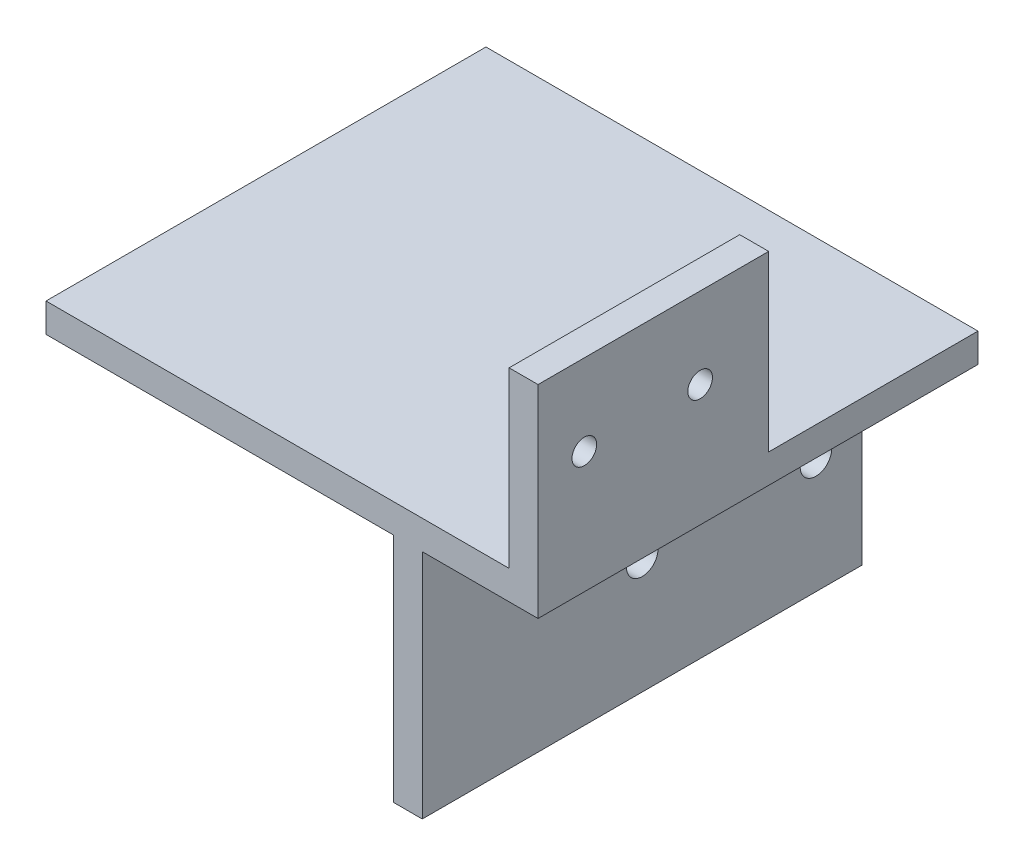
ISO-10303-21;
HEADER;
FILE_DESCRIPTION(('STEP AP214'),'2;1');
FILE_NAME('part.step','',(''),(''),'','','');
FILE_SCHEMA(('AUTOMOTIVE_DESIGN { 1 0 10303 214 1 1 1 1 }'));
ENDSEC;
DATA;
#1=APPLICATION_CONTEXT('core data for automotive mechanical design processes');
#2=APPLICATION_PROTOCOL_DEFINITION('international standard','automotive_design',2000,#1);
#3=PRODUCT_CONTEXT('',#1,'mechanical');
#4=PRODUCT('Part','Part','',(#3));
#5=PRODUCT_RELATED_PRODUCT_CATEGORY('part','',(#4));
#6=PRODUCT_DEFINITION_FORMATION('','',#4);
#7=PRODUCT_DEFINITION_CONTEXT('part definition',#1,'design');
#8=PRODUCT_DEFINITION('design','',#6,#7);
#9=PRODUCT_DEFINITION_SHAPE('','',#8);
#10=(LENGTH_UNIT() NAMED_UNIT(*) SI_UNIT(.MILLI.,.METRE.));
#11=(NAMED_UNIT(*) PLANE_ANGLE_UNIT() SI_UNIT($,.RADIAN.));
#12=(NAMED_UNIT(*) SI_UNIT($,.STERADIAN.) SOLID_ANGLE_UNIT());
#13=UNCERTAINTY_MEASURE_WITH_UNIT(LENGTH_MEASURE(1.E-05),#10,'distance_accuracy_value','');
#14=(GEOMETRIC_REPRESENTATION_CONTEXT(3) GLOBAL_UNCERTAINTY_ASSIGNED_CONTEXT((#13)) GLOBAL_UNIT_ASSIGNED_CONTEXT((#10,
#11,#12)) REPRESENTATION_CONTEXT('',''));
#15=CARTESIAN_POINT('',(0.,0.,0.));
#16=DIRECTION('',(0.,0.,1.));
#17=DIRECTION('',(1.,0.,0.));
#18=AXIS2_PLACEMENT_3D('',#15,#16,#17);
#19=CARTESIAN_POINT('',(15.875,28.575,48.26));
#20=DIRECTION('',(0.,-1.,0.));
#21=DIRECTION('',(1.,0.,0.));
#22=AXIS2_PLACEMENT_3D('',#19,#20,#21);
#23=PLANE('',#22);
#24=DIRECTION('',(0.,0.,1.));
#25=VECTOR('',#24,1.);
#26=CARTESIAN_POINT('',(12.7,28.575,48.26));
#27=LINE('',#26,#25);
#28=CARTESIAN_POINT('',(12.7,28.575,22.9610956435768));
#29=VERTEX_POINT('',#28);
#30=CARTESIAN_POINT('',(12.7,28.575,48.26));
#31=VERTEX_POINT('',#30);
#32=EDGE_CURVE('E135',#29,#31,#27,.T.);
#33=ORIENTED_EDGE('',*,*,#32,.F.);
#34=DIRECTION('',(-1.,0.,0.));
#35=VECTOR('',#34,1.);
#36=CARTESIAN_POINT('',(15.875,28.575,22.9610956435768));
#37=LINE('',#36,#35);
#38=CARTESIAN_POINT('',(15.875,28.575,22.9610956435768));
#39=VERTEX_POINT('',#38);
#40=EDGE_CURVE('E49',#39,#29,#37,.T.);
#41=ORIENTED_EDGE('',*,*,#40,.F.);
#42=DIRECTION('',(0.,0.,-1.));
#43=VECTOR('',#42,1.);
#44=CARTESIAN_POINT('',(15.875,28.575,48.26));
#45=LINE('',#44,#43);
#46=CARTESIAN_POINT('',(15.875,28.575,0.));
#47=VERTEX_POINT('',#46);
#48=EDGE_CURVE('E139',#39,#47,#45,.T.);
#49=ORIENTED_EDGE('',*,*,#48,.T.);
#50=DIRECTION('',(-1.,0.,0.));
#51=VECTOR('',#50,1.);
#52=CARTESIAN_POINT('',(15.875,28.575,0.));
#53=LINE('',#52,#51);
#54=CARTESIAN_POINT('',(-38.1,28.575,0.));
#55=VERTEX_POINT('',#54);
#56=EDGE_CURVE('E209',#47,#55,#53,.T.);
#57=ORIENTED_EDGE('',*,*,#56,.T.);
#58=DIRECTION('',(0.,0.,-1.));
#59=VECTOR('',#58,1.);
#60=CARTESIAN_POINT('',(-38.1,28.575,48.26));
#61=LINE('',#60,#59);
#62=CARTESIAN_POINT('',(-38.1,28.575,48.26));
#63=VERTEX_POINT('',#62);
#64=EDGE_CURVE('E179',#63,#55,#61,.T.);
#65=ORIENTED_EDGE('',*,*,#64,.F.);
#66=DIRECTION('',(-1.,0.,0.));
#67=VECTOR('',#66,1.);
#68=CARTESIAN_POINT('',(15.875,28.575,48.26));
#69=LINE('',#68,#67);
#70=EDGE_CURVE('E55',#31,#63,#69,.T.);
#71=ORIENTED_EDGE('',*,*,#70,.F.);
#72=EDGE_LOOP('',(#33,#41,#49,#57,#65,#71));
#73=FACE_BOUND('',#72,.T.);
#74=ADVANCED_FACE('F32',(#73),#23,.F.);
#75=CARTESIAN_POINT('',(0.,25.4,48.26));
#76=DIRECTION('',(1.,0.,0.));
#77=DIRECTION('',(0.,0.,-1.));
#78=AXIS2_PLACEMENT_3D('',#75,#76,#77);
#79=PLANE('',#78);
#80=CARTESIAN_POINT('',(0.,12.7,5.08));
#81=DIRECTION('',(-1.,0.,0.));
#82=DIRECTION('',(0.,0.,1.));
#83=AXIS2_PLACEMENT_3D('',#80,#81,#82);
#84=CIRCLE('',#83,1.7272);
#85=CARTESIAN_POINT('',(0.,12.7,6.8072));
#86=VERTEX_POINT('',#85);
#87=EDGE_CURVE('E261',#86,#86,#84,.T.);
#88=ORIENTED_EDGE('',*,*,#87,.F.);
#89=EDGE_LOOP('',(#88));
#90=FACE_BOUND('',#89,.T.);
#91=CARTESIAN_POINT('',(0.,12.7,24.13));
#92=DIRECTION('',(-1.,0.,0.));
#93=DIRECTION('',(0.,0.,1.));
#94=AXIS2_PLACEMENT_3D('',#91,#92,#93);
#95=CIRCLE('',#94,1.7272);
#96=CARTESIAN_POINT('',(0.,12.7,25.8572));
#97=VERTEX_POINT('',#96);
#98=EDGE_CURVE('E255',#97,#97,#95,.T.);
#99=ORIENTED_EDGE('',*,*,#98,.F.);
#100=EDGE_LOOP('',(#99));
#101=FACE_BOUND('',#100,.T.);
#102=DIRECTION('',(0.,-1.,0.));
#103=VECTOR('',#102,1.);
#104=CARTESIAN_POINT('',(0.,25.4,0.));
#105=LINE('',#104,#103);
#106=CARTESIAN_POINT('',(0.,25.4,0.));
#107=VERTEX_POINT('',#106);
#108=CARTESIAN_POINT('',(0.,0.,0.));
#109=VERTEX_POINT('',#108);
#110=EDGE_CURVE('E140',#107,#109,#105,.T.);
#111=ORIENTED_EDGE('',*,*,#110,.T.);
#112=DIRECTION('',(0.,0.,-1.));
#113=VECTOR('',#112,1.);
#114=CARTESIAN_POINT('',(0.,0.,48.26));
#115=LINE('',#114,#113);
#116=CARTESIAN_POINT('',(0.,0.,48.26));
#117=VERTEX_POINT('',#116);
#118=EDGE_CURVE('E11',#117,#109,#115,.T.);
#119=ORIENTED_EDGE('',*,*,#118,.F.);
#120=DIRECTION('',(0.,-1.,0.));
#121=VECTOR('',#120,1.);
#122=CARTESIAN_POINT('',(0.,25.4,48.26));
#123=LINE('',#122,#121);
#124=CARTESIAN_POINT('',(0.,25.4,48.26));
#125=VERTEX_POINT('',#124);
#126=EDGE_CURVE('E158',#125,#117,#123,.T.);
#127=ORIENTED_EDGE('',*,*,#126,.F.);
#128=DIRECTION('',(0.,0.,-1.));
#129=VECTOR('',#128,1.);
#130=CARTESIAN_POINT('',(0.,25.4,48.26));
#131=LINE('',#130,#129);
#132=EDGE_CURVE('E214',#125,#107,#131,.T.);
#133=ORIENTED_EDGE('',*,*,#132,.T.);
#134=EDGE_LOOP('',(#111,#119,#127,#133));
#135=FACE_BOUND('',#134,.T.);
#136=ADVANCED_FACE('F34',(#90,#101,#135),#79,.F.);
#137=CARTESIAN_POINT('',(3.175,0.,48.26));
#138=DIRECTION('',(0.,1.,0.));
#139=DIRECTION('',(0.,0.,1.));
#140=AXIS2_PLACEMENT_3D('',#137,#138,#139);
#141=PLANE('',#140);
#142=DIRECTION('',(1.,0.,0.));
#143=VECTOR('',#142,1.);
#144=CARTESIAN_POINT('',(3.175,0.,0.));
#145=LINE('',#144,#143);
#146=CARTESIAN_POINT('',(3.175,0.,0.));
#147=VERTEX_POINT('',#146);
#148=EDGE_CURVE('E143',#109,#147,#145,.T.);
#149=ORIENTED_EDGE('',*,*,#148,.T.);
#150=DIRECTION('',(0.,0.,-1.));
#151=VECTOR('',#150,1.);
#152=CARTESIAN_POINT('',(3.175,0.,48.26));
#153=LINE('',#152,#151);
#154=CARTESIAN_POINT('',(3.175,0.,48.26));
#155=VERTEX_POINT('',#154);
#156=EDGE_CURVE('E41',#155,#147,#153,.T.);
#157=ORIENTED_EDGE('',*,*,#156,.F.);
#158=DIRECTION('',(1.,0.,0.));
#159=VECTOR('',#158,1.);
#160=CARTESIAN_POINT('',(3.175,0.,48.26));
#161=LINE('',#160,#159);
#162=EDGE_CURVE('E161',#117,#155,#161,.T.);
#163=ORIENTED_EDGE('',*,*,#162,.F.);
#164=ORIENTED_EDGE('',*,*,#118,.T.);
#165=EDGE_LOOP('',(#149,#157,#163,#164));
#166=FACE_BOUND('',#165,.T.);
#167=ADVANCED_FACE('F270',(#166),#141,.F.);
#168=CARTESIAN_POINT('',(3.175,25.4,48.26));
#169=DIRECTION('',(-1.,0.,0.));
#170=DIRECTION('',(0.,-1.,0.));
#171=AXIS2_PLACEMENT_3D('',#168,#169,#170);
#172=PLANE('',#171);
#173=CARTESIAN_POINT('',(3.175,12.7,5.08));
#174=DIRECTION('',(-1.,0.,0.));
#175=DIRECTION('',(0.,-1.,0.));
#176=AXIS2_PLACEMENT_3D('',#173,#174,#175);
#177=CIRCLE('',#176,1.7272);
#178=CARTESIAN_POINT('',(3.175,10.9728,5.08));
#179=VERTEX_POINT('',#178);
#180=EDGE_CURVE('E258',#179,#179,#177,.T.);
#181=ORIENTED_EDGE('',*,*,#180,.T.);
#182=EDGE_LOOP('',(#181));
#183=FACE_BOUND('',#182,.T.);
#184=CARTESIAN_POINT('',(3.175,12.7,24.13));
#185=DIRECTION('',(-1.,0.,0.));
#186=DIRECTION('',(0.,-1.,0.));
#187=AXIS2_PLACEMENT_3D('',#184,#185,#186);
#188=CIRCLE('',#187,1.7272);
#189=CARTESIAN_POINT('',(3.175,10.9728,24.13));
#190=VERTEX_POINT('',#189);
#191=EDGE_CURVE('E252',#190,#190,#188,.T.);
#192=ORIENTED_EDGE('',*,*,#191,.T.);
#193=EDGE_LOOP('',(#192));
#194=FACE_BOUND('',#193,.T.);
#195=DIRECTION('',(0.,1.,0.));
#196=VECTOR('',#195,1.);
#197=CARTESIAN_POINT('',(3.175,25.4,0.));
#198=LINE('',#197,#196);
#199=CARTESIAN_POINT('',(3.175,25.4,0.));
#200=VERTEX_POINT('',#199);
#201=EDGE_CURVE('E195',#147,#200,#198,.T.);
#202=ORIENTED_EDGE('',*,*,#201,.T.);
#203=DIRECTION('',(0.,0.,-1.));
#204=VECTOR('',#203,1.);
#205=CARTESIAN_POINT('',(3.175,25.4,48.26));
#206=LINE('',#205,#204);
#207=CARTESIAN_POINT('',(3.175,25.4,48.26));
#208=VERTEX_POINT('',#207);
#209=EDGE_CURVE('E186',#208,#200,#206,.T.);
#210=ORIENTED_EDGE('',*,*,#209,.F.);
#211=DIRECTION('',(0.,1.,0.));
#212=VECTOR('',#211,1.);
#213=CARTESIAN_POINT('',(3.175,25.4,48.26));
#214=LINE('',#213,#212);
#215=EDGE_CURVE('E164',#155,#208,#214,.T.);
#216=ORIENTED_EDGE('',*,*,#215,.F.);
#217=ORIENTED_EDGE('',*,*,#156,.T.);
#218=EDGE_LOOP('',(#202,#210,#216,#217));
#219=FACE_BOUND('',#218,.T.);
#220=ADVANCED_FACE('F193',(#183,#194,#219),#172,.F.);
#221=CARTESIAN_POINT('',(15.875,25.4,48.26));
#222=DIRECTION('',(0.,1.,0.));
#223=DIRECTION('',(-1.,0.,0.));
#224=AXIS2_PLACEMENT_3D('',#221,#222,#223);
#225=PLANE('',#224);
#226=DIRECTION('',(1.,0.,0.));
#227=VECTOR('',#226,1.);
#228=CARTESIAN_POINT('',(15.875,25.4,0.));
#229=LINE('',#228,#227);
#230=CARTESIAN_POINT('',(15.875,25.4,0.));
#231=VERTEX_POINT('',#230);
#232=EDGE_CURVE('E202',#200,#231,#229,.T.);
#233=ORIENTED_EDGE('',*,*,#232,.T.);
#234=DIRECTION('',(0.,0.,-1.));
#235=VECTOR('',#234,1.);
#236=CARTESIAN_POINT('',(15.875,25.4,48.26));
#237=LINE('',#236,#235);
#238=CARTESIAN_POINT('',(15.875,25.4,48.26));
#239=VERTEX_POINT('',#238);
#240=EDGE_CURVE('E178',#239,#231,#237,.T.);
#241=ORIENTED_EDGE('',*,*,#240,.F.);
#242=DIRECTION('',(1.,0.,0.));
#243=VECTOR('',#242,1.);
#244=CARTESIAN_POINT('',(15.875,25.4,48.26));
#245=LINE('',#244,#243);
#246=EDGE_CURVE('E166',#208,#239,#245,.T.);
#247=ORIENTED_EDGE('',*,*,#246,.F.);
#248=ORIENTED_EDGE('',*,*,#209,.T.);
#249=EDGE_LOOP('',(#233,#241,#247,#248));
#250=FACE_BOUND('',#249,.T.);
#251=ADVANCED_FACE('F281',(#250),#225,.F.);
#252=CARTESIAN_POINT('',(15.875,28.575,48.26));
#253=DIRECTION('',(-1.,0.,0.));
#254=DIRECTION('',(0.,-1.,0.));
#255=AXIS2_PLACEMENT_3D('',#252,#253,#254);
#256=PLANE('',#255);
#257=CARTESIAN_POINT('',(15.875,38.735,43.18));
#258=DIRECTION('',(1.,0.,0.));
#259=DIRECTION('',(0.,0.,-1.));
#260=AXIS2_PLACEMENT_3D('',#257,#258,#259);
#261=CIRCLE('',#260,1.35255);
#262=CARTESIAN_POINT('',(15.875,38.735,41.82745));
#263=VERTEX_POINT('',#262);
#264=EDGE_CURVE('E249',#263,#263,#261,.T.);
#265=ORIENTED_EDGE('',*,*,#264,.F.);
#266=EDGE_LOOP('',(#265));
#267=FACE_BOUND('',#266,.T.);
#268=CARTESIAN_POINT('',(15.875,38.735,30.48));
#269=DIRECTION('',(1.,0.,0.));
#270=DIRECTION('',(0.,0.,-1.));
#271=AXIS2_PLACEMENT_3D('',#268,#269,#270);
#272=CIRCLE('',#271,1.35255);
#273=CARTESIAN_POINT('',(15.875,38.735,29.12745));
#274=VERTEX_POINT('',#273);
#275=EDGE_CURVE('E243',#274,#274,#272,.T.);
#276=ORIENTED_EDGE('',*,*,#275,.F.);
#277=EDGE_LOOP('',(#276));
#278=FACE_BOUND('',#277,.T.);
#279=DIRECTION('',(0.,1.,0.));
#280=VECTOR('',#279,1.);
#281=CARTESIAN_POINT('',(15.875,28.575,0.));
#282=LINE('',#281,#280);
#283=EDGE_CURVE('E204',#231,#47,#282,.T.);
#284=ORIENTED_EDGE('',*,*,#283,.T.);
#285=ORIENTED_EDGE('',*,*,#48,.F.);
#286=DIRECTION('',(0.,-1.,0.));
#287=VECTOR('',#286,1.);
#288=CARTESIAN_POINT('',(15.875,47.625,22.9610956435768));
#289=LINE('',#288,#287);
#290=CARTESIAN_POINT('',(15.875,47.625,22.9610956435768));
#291=VERTEX_POINT('',#290);
#292=EDGE_CURVE('E120',#291,#39,#289,.T.);
#293=ORIENTED_EDGE('',*,*,#292,.F.);
#294=DIRECTION('',(0.,0.,-1.));
#295=VECTOR('',#294,1.);
#296=CARTESIAN_POINT('',(15.875,47.625,48.26));
#297=LINE('',#296,#295);
#298=CARTESIAN_POINT('',(15.875,47.625,48.26));
#299=VERTEX_POINT('',#298);
#300=EDGE_CURVE('E126',#299,#291,#297,.T.);
#301=ORIENTED_EDGE('',*,*,#300,.F.);
#302=DIRECTION('',(0.,1.,0.));
#303=VECTOR('',#302,1.);
#304=CARTESIAN_POINT('',(15.875,28.575,48.26));
#305=LINE('',#304,#303);
#306=EDGE_CURVE('E168',#239,#299,#305,.T.);
#307=ORIENTED_EDGE('',*,*,#306,.F.);
#308=ORIENTED_EDGE('',*,*,#240,.T.);
#309=EDGE_LOOP('',(#284,#285,#293,#301,#307,#308));
#310=FACE_BOUND('',#309,.T.);
#311=ADVANCED_FACE('F138',(#267,#278,#310),#256,.F.);
#312=CARTESIAN_POINT('',(-38.1,28.575,48.26));
#313=DIRECTION('',(1.,0.,0.));
#314=DIRECTION('',(0.,0.,-1.));
#315=AXIS2_PLACEMENT_3D('',#312,#313,#314);
#316=PLANE('',#315);
#317=DIRECTION('',(0.,-1.,0.));
#318=VECTOR('',#317,1.);
#319=CARTESIAN_POINT('',(-38.1,28.575,0.));
#320=LINE('',#319,#318);
#321=CARTESIAN_POINT('',(-38.1,25.4,0.));
#322=VERTEX_POINT('',#321);
#323=EDGE_CURVE('E211',#55,#322,#320,.T.);
#324=ORIENTED_EDGE('',*,*,#323,.T.);
#325=DIRECTION('',(0.,0.,-1.));
#326=VECTOR('',#325,1.);
#327=CARTESIAN_POINT('',(-38.1,25.4,48.26));
#328=LINE('',#327,#326);
#329=CARTESIAN_POINT('',(-38.1,25.4,48.26));
#330=VERTEX_POINT('',#329);
#331=EDGE_CURVE('E216',#330,#322,#328,.T.);
#332=ORIENTED_EDGE('',*,*,#331,.F.);
#333=DIRECTION('',(0.,-1.,0.));
#334=VECTOR('',#333,1.);
#335=CARTESIAN_POINT('',(-38.1,28.575,48.26));
#336=LINE('',#335,#334);
#337=EDGE_CURVE('E172',#63,#330,#336,.T.);
#338=ORIENTED_EDGE('',*,*,#337,.F.);
#339=ORIENTED_EDGE('',*,*,#64,.T.);
#340=EDGE_LOOP('',(#324,#332,#338,#339));
#341=FACE_BOUND('',#340,.T.);
#342=ADVANCED_FACE('F227',(#341),#316,.F.);
#343=CARTESIAN_POINT('',(-38.1,25.4,48.26));
#344=DIRECTION('',(0.,1.,0.));
#345=DIRECTION('',(-1.,0.,0.));
#346=AXIS2_PLACEMENT_3D('',#343,#344,#345);
#347=PLANE('',#346);
#348=DIRECTION('',(1.,0.,0.));
#349=VECTOR('',#348,1.);
#350=CARTESIAN_POINT('',(-38.1,25.4,0.));
#351=LINE('',#350,#349);
#352=EDGE_CURVE('E162',#322,#107,#351,.T.);
#353=ORIENTED_EDGE('',*,*,#352,.T.);
#354=ORIENTED_EDGE('',*,*,#132,.F.);
#355=DIRECTION('',(1.,0.,0.));
#356=VECTOR('',#355,1.);
#357=CARTESIAN_POINT('',(-38.1,25.4,48.26));
#358=LINE('',#357,#356);
#359=EDGE_CURVE('E217',#330,#125,#358,.T.);
#360=ORIENTED_EDGE('',*,*,#359,.F.);
#361=ORIENTED_EDGE('',*,*,#331,.T.);
#362=EDGE_LOOP('',(#353,#354,#360,#361));
#363=FACE_BOUND('',#362,.T.);
#364=ADVANCED_FACE('F230',(#363),#347,.F.);
#365=CARTESIAN_POINT('',(0.,0.,48.26));
#366=DIRECTION('',(0.,0.,-1.));
#367=DIRECTION('',(-1.,0.,0.));
#368=AXIS2_PLACEMENT_3D('',#365,#366,#367);
#369=PLANE('',#368);
#370=ORIENTED_EDGE('',*,*,#126,.T.);
#371=ORIENTED_EDGE('',*,*,#162,.T.);
#372=ORIENTED_EDGE('',*,*,#215,.T.);
#373=ORIENTED_EDGE('',*,*,#246,.T.);
#374=ORIENTED_EDGE('',*,*,#306,.T.);
#375=DIRECTION('',(1.,0.,0.));
#376=VECTOR('',#375,1.);
#377=CARTESIAN_POINT('',(15.875,47.625,48.26));
#378=LINE('',#377,#376);
#379=CARTESIAN_POINT('',(12.7,47.625,48.26));
#380=VERTEX_POINT('',#379);
#381=EDGE_CURVE('E132',#380,#299,#378,.T.);
#382=ORIENTED_EDGE('',*,*,#381,.F.);
#383=DIRECTION('',(0.,-1.,0.));
#384=VECTOR('',#383,1.);
#385=CARTESIAN_POINT('',(12.7,47.625,48.26));
#386=LINE('',#385,#384);
#387=EDGE_CURVE('E145',#380,#31,#386,.T.);
#388=ORIENTED_EDGE('',*,*,#387,.T.);
#389=ORIENTED_EDGE('',*,*,#70,.T.);
#390=ORIENTED_EDGE('',*,*,#337,.T.);
#391=ORIENTED_EDGE('',*,*,#359,.T.);
#392=EDGE_LOOP('',(#370,#371,#372,#373,#374,#382,#388,#389,#390,#391));
#393=FACE_BOUND('',#392,.T.);
#394=ADVANCED_FACE('F235',(#393),#369,.F.);
#395=CARTESIAN_POINT('',(0.,0.,0.));
#396=DIRECTION('',(0.,0.,-1.));
#397=DIRECTION('',(-1.,0.,0.));
#398=AXIS2_PLACEMENT_3D('',#395,#396,#397);
#399=PLANE('',#398);
#400=ORIENTED_EDGE('',*,*,#110,.F.);
#401=ORIENTED_EDGE('',*,*,#352,.F.);
#402=ORIENTED_EDGE('',*,*,#323,.F.);
#403=ORIENTED_EDGE('',*,*,#56,.F.);
#404=ORIENTED_EDGE('',*,*,#283,.F.);
#405=ORIENTED_EDGE('',*,*,#232,.F.);
#406=ORIENTED_EDGE('',*,*,#201,.F.);
#407=ORIENTED_EDGE('',*,*,#148,.F.);
#408=EDGE_LOOP('',(#400,#401,#402,#403,#404,#405,#406,#407));
#409=FACE_BOUND('',#408,.T.);
#410=ADVANCED_FACE('F200',(#409),#399,.T.);
#411=CARTESIAN_POINT('',(15.875,47.625,22.9610956435768));
#412=DIRECTION('',(0.,0.,1.));
#413=DIRECTION('',(1.,0.,0.));
#414=AXIS2_PLACEMENT_3D('',#411,#412,#413);
#415=PLANE('',#414);
#416=ORIENTED_EDGE('',*,*,#40,.T.);
#417=DIRECTION('',(0.,-1.,0.));
#418=VECTOR('',#417,1.);
#419=CARTESIAN_POINT('',(12.7,47.625,22.9610956435768));
#420=LINE('',#419,#418);
#421=CARTESIAN_POINT('',(12.7,47.625,22.9610956435768));
#422=VERTEX_POINT('',#421);
#423=EDGE_CURVE('E122',#422,#29,#420,.T.);
#424=ORIENTED_EDGE('',*,*,#423,.F.);
#425=DIRECTION('',(-1.,0.,0.));
#426=VECTOR('',#425,1.);
#427=CARTESIAN_POINT('',(15.875,47.625,22.9610956435768));
#428=LINE('',#427,#426);
#429=EDGE_CURVE('E116',#291,#422,#428,.T.);
#430=ORIENTED_EDGE('',*,*,#429,.F.);
#431=ORIENTED_EDGE('',*,*,#292,.T.);
#432=EDGE_LOOP('',(#416,#424,#430,#431));
#433=FACE_BOUND('',#432,.T.);
#434=ADVANCED_FACE('F118',(#433),#415,.F.);
#435=CARTESIAN_POINT('',(12.7,47.625,48.26));
#436=DIRECTION('',(1.,0.,0.));
#437=DIRECTION('',(0.,1.,0.));
#438=AXIS2_PLACEMENT_3D('',#435,#436,#437);
#439=PLANE('',#438);
#440=CARTESIAN_POINT('',(12.7,38.735,43.18));
#441=DIRECTION('',(1.,0.,0.));
#442=DIRECTION('',(0.,1.,0.));
#443=AXIS2_PLACEMENT_3D('',#440,#441,#442);
#444=CIRCLE('',#443,1.35255);
#445=CARTESIAN_POINT('',(12.7,40.08755,43.18));
#446=VERTEX_POINT('',#445);
#447=EDGE_CURVE('E246',#446,#446,#444,.T.);
#448=ORIENTED_EDGE('',*,*,#447,.T.);
#449=EDGE_LOOP('',(#448));
#450=FACE_BOUND('',#449,.T.);
#451=CARTESIAN_POINT('',(12.7,38.735,30.48));
#452=DIRECTION('',(1.,0.,0.));
#453=DIRECTION('',(0.,1.,0.));
#454=AXIS2_PLACEMENT_3D('',#451,#452,#453);
#455=CIRCLE('',#454,1.35255);
#456=CARTESIAN_POINT('',(12.7,40.08755,30.48));
#457=VERTEX_POINT('',#456);
#458=EDGE_CURVE('E240',#457,#457,#455,.T.);
#459=ORIENTED_EDGE('',*,*,#458,.T.);
#460=EDGE_LOOP('',(#459));
#461=FACE_BOUND('',#460,.T.);
#462=ORIENTED_EDGE('',*,*,#32,.T.);
#463=ORIENTED_EDGE('',*,*,#387,.F.);
#464=DIRECTION('',(0.,0.,1.));
#465=VECTOR('',#464,1.);
#466=CARTESIAN_POINT('',(12.7,47.625,48.26));
#467=LINE('',#466,#465);
#468=EDGE_CURVE('E125',#422,#380,#467,.T.);
#469=ORIENTED_EDGE('',*,*,#468,.F.);
#470=ORIENTED_EDGE('',*,*,#423,.T.);
#471=EDGE_LOOP('',(#462,#463,#469,#470));
#472=FACE_BOUND('',#471,.T.);
#473=ADVANCED_FACE('F312',(#450,#461,#472),#439,.F.);
#474=CARTESIAN_POINT('',(0.,47.625,0.));
#475=DIRECTION('',(0.,1.,0.));
#476=DIRECTION('',(-1.,0.,0.));
#477=AXIS2_PLACEMENT_3D('',#474,#475,#476);
#478=PLANE('',#477);
#479=ORIENTED_EDGE('',*,*,#300,.T.);
#480=ORIENTED_EDGE('',*,*,#429,.T.);
#481=ORIENTED_EDGE('',*,*,#468,.T.);
#482=ORIENTED_EDGE('',*,*,#381,.T.);
#483=EDGE_LOOP('',(#479,#480,#481,#482));
#484=FACE_BOUND('',#483,.T.);
#485=ADVANCED_FACE('F130',(#484),#478,.T.);
#486=CARTESIAN_POINT('',(15.875,38.735,30.48));
#487=DIRECTION('',(1.,0.,0.));
#488=DIRECTION('',(0.,0.,-1.));
#489=AXIS2_PLACEMENT_3D('',#486,#487,#488);
#490=CYLINDRICAL_SURFACE('',#489,1.35255);
#491=ORIENTED_EDGE('',*,*,#275,.T.);
#492=EDGE_LOOP('',(#491));
#493=FACE_BOUND('',#492,.T.);
#494=ORIENTED_EDGE('',*,*,#458,.F.);
#495=EDGE_LOOP('',(#494));
#496=FACE_BOUND('',#495,.T.);
#497=ADVANCED_FACE('F306',(#493,#496),#490,.F.);
#498=CARTESIAN_POINT('',(15.875,38.735,43.18));
#499=DIRECTION('',(1.,0.,0.));
#500=DIRECTION('',(0.,0.,-1.));
#501=AXIS2_PLACEMENT_3D('',#498,#499,#500);
#502=CYLINDRICAL_SURFACE('',#501,1.35255);
#503=ORIENTED_EDGE('',*,*,#264,.T.);
#504=EDGE_LOOP('',(#503));
#505=FACE_BOUND('',#504,.T.);
#506=ORIENTED_EDGE('',*,*,#447,.F.);
#507=EDGE_LOOP('',(#506));
#508=FACE_BOUND('',#507,.T.);
#509=ADVANCED_FACE('F276',(#505,#508),#502,.F.);
#510=CARTESIAN_POINT('',(0.,12.7,24.13));
#511=DIRECTION('',(-1.,0.,0.));
#512=DIRECTION('',(0.,0.,1.));
#513=AXIS2_PLACEMENT_3D('',#510,#511,#512);
#514=CYLINDRICAL_SURFACE('',#513,1.7272);
#515=ORIENTED_EDGE('',*,*,#98,.T.);
#516=EDGE_LOOP('',(#515));
#517=FACE_BOUND('',#516,.T.);
#518=ORIENTED_EDGE('',*,*,#191,.F.);
#519=EDGE_LOOP('',(#518));
#520=FACE_BOUND('',#519,.T.);
#521=ADVANCED_FACE('F273',(#517,#520),#514,.F.);
#522=CARTESIAN_POINT('',(0.,12.7,5.08));
#523=DIRECTION('',(-1.,0.,0.));
#524=DIRECTION('',(0.,0.,1.));
#525=AXIS2_PLACEMENT_3D('',#522,#523,#524);
#526=CYLINDRICAL_SURFACE('',#525,1.7272);
#527=ORIENTED_EDGE('',*,*,#87,.T.);
#528=EDGE_LOOP('',(#527));
#529=FACE_BOUND('',#528,.T.);
#530=ORIENTED_EDGE('',*,*,#180,.F.);
#531=EDGE_LOOP('',(#530));
#532=FACE_BOUND('',#531,.T.);
#533=ADVANCED_FACE('F265',(#529,#532),#526,.F.);
#534=CLOSED_SHELL('',(#74,#136,#167,#220,#251,#311,#342,#364,#394,#410,#434,#473,#485,#497,#509,
#521,#533));
#535=MANIFOLD_SOLID_BREP('B2',#534);
#536=ADVANCED_BREP_SHAPE_REPRESENTATION('',(#18,#535),#14);
#537=SHAPE_DEFINITION_REPRESENTATION(#9,#536);
ENDSEC;
END-ISO-10303-21;
